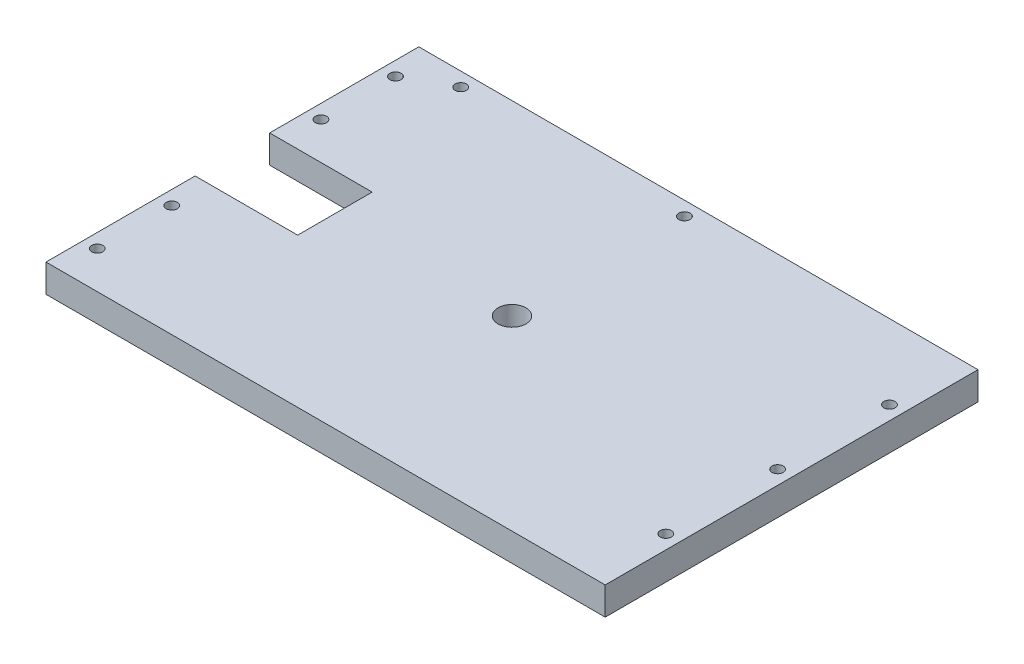
ISO-10303-21;
HEADER;
FILE_DESCRIPTION(('STEP AP214'),'2;1');
FILE_NAME('part.step','',(''),(''),'','','');
FILE_SCHEMA(('AUTOMOTIVE_DESIGN { 1 0 10303 214 1 1 1 1 }'));
ENDSEC;
DATA;
#1=APPLICATION_CONTEXT('core data for automotive mechanical design processes');
#2=APPLICATION_PROTOCOL_DEFINITION('international standard','automotive_design',2000,#1);
#3=PRODUCT_CONTEXT('',#1,'mechanical');
#4=PRODUCT('Part','Part','',(#3));
#5=PRODUCT_RELATED_PRODUCT_CATEGORY('part','',(#4));
#6=PRODUCT_DEFINITION_FORMATION('','',#4);
#7=PRODUCT_DEFINITION_CONTEXT('part definition',#1,'design');
#8=PRODUCT_DEFINITION('design','',#6,#7);
#9=PRODUCT_DEFINITION_SHAPE('','',#8);
#10=(LENGTH_UNIT() NAMED_UNIT(*) SI_UNIT(.MILLI.,.METRE.));
#11=(NAMED_UNIT(*) PLANE_ANGLE_UNIT() SI_UNIT($,.RADIAN.));
#12=(NAMED_UNIT(*) SI_UNIT($,.STERADIAN.) SOLID_ANGLE_UNIT());
#13=UNCERTAINTY_MEASURE_WITH_UNIT(LENGTH_MEASURE(1.E-05),#10,'distance_accuracy_value','');
#14=(GEOMETRIC_REPRESENTATION_CONTEXT(3) GLOBAL_UNCERTAINTY_ASSIGNED_CONTEXT((#13)) GLOBAL_UNIT_ASSIGNED_CONTEXT((#10,
#11,#12)) REPRESENTATION_CONTEXT('',''));
#15=CARTESIAN_POINT('',(0.,0.,0.));
#16=DIRECTION('',(0.,0.,1.));
#17=DIRECTION('',(1.,0.,0.));
#18=AXIS2_PLACEMENT_3D('',#15,#16,#17);
#19=CARTESIAN_POINT('',(0.,15.,0.));
#20=DIRECTION('',(0.,-1.,0.));
#21=DIRECTION('',(0.,0.,-1.));
#22=AXIS2_PLACEMENT_3D('',#19,#20,#21);
#23=PLANE('',#22);
#24=DIRECTION('',(0.,0.,1.));
#25=VECTOR('',#24,1.);
#26=CARTESIAN_POINT('',(-168.032786885246,15.,39.4262295081967));
#27=LINE('',#26,#25);
#28=CARTESIAN_POINT('',(-168.032786885246,15.,-40.5737704918033));
#29=VERTEX_POINT('',#28);
#30=CARTESIAN_POINT('',(-168.032786885246,15.,39.4262295081967));
#31=VERTEX_POINT('',#30);
#32=EDGE_CURVE('E145',#29,#31,#27,.T.);
#33=ORIENTED_EDGE('',*,*,#32,.T.);
#34=DIRECTION('',(1.,0.,0.));
#35=VECTOR('',#34,1.);
#36=CARTESIAN_POINT('',(-113.032786885246,15.,39.4262295081967));
#37=LINE('',#36,#35);
#38=CARTESIAN_POINT('',(-113.032786885246,15.,39.4262295081967));
#39=VERTEX_POINT('',#38);
#40=EDGE_CURVE('E93',#31,#39,#37,.T.);
#41=ORIENTED_EDGE('',*,*,#40,.T.);
#42=DIRECTION('',(0.,0.,1.));
#43=VECTOR('',#42,1.);
#44=CARTESIAN_POINT('',(-113.032786885246,15.,79.4262295081967));
#45=LINE('',#44,#43);
#46=CARTESIAN_POINT('',(-113.032786885246,15.,79.4262295081967));
#47=VERTEX_POINT('',#46);
#48=EDGE_CURVE('E160',#39,#47,#45,.T.);
#49=ORIENTED_EDGE('',*,*,#48,.T.);
#50=DIRECTION('',(-1.,0.,0.));
#51=VECTOR('',#50,1.);
#52=CARTESIAN_POINT('',(-168.032786885246,15.,79.4262295081967));
#53=LINE('',#52,#51);
#54=CARTESIAN_POINT('',(-168.032786885246,15.,79.4262295081967));
#55=VERTEX_POINT('',#54);
#56=EDGE_CURVE('E173',#47,#55,#53,.T.);
#57=ORIENTED_EDGE('',*,*,#56,.T.);
#58=DIRECTION('',(0.,0.,1.));
#59=VECTOR('',#58,1.);
#60=CARTESIAN_POINT('',(-168.032786885246,15.,159.426229508197));
#61=LINE('',#60,#59);
#62=CARTESIAN_POINT('',(-168.032786885246,15.,159.426229508197));
#63=VERTEX_POINT('',#62);
#64=EDGE_CURVE('E112',#55,#63,#61,.T.);
#65=ORIENTED_EDGE('',*,*,#64,.T.);
#66=DIRECTION('',(1.,0.,0.));
#67=VECTOR('',#66,1.);
#68=CARTESIAN_POINT('',(131.967213114754,15.,159.426229508197));
#69=LINE('',#68,#67);
#70=CARTESIAN_POINT('',(131.967213114754,15.,159.426229508197));
#71=VERTEX_POINT('',#70);
#72=EDGE_CURVE('E106',#63,#71,#69,.T.);
#73=ORIENTED_EDGE('',*,*,#72,.T.);
#74=DIRECTION('',(0.,0.,-1.));
#75=VECTOR('',#74,1.);
#76=CARTESIAN_POINT('',(131.967213114754,15.,-40.5737704918033));
#77=LINE('',#76,#75);
#78=CARTESIAN_POINT('',(131.967213114754,15.,-40.5737704918033));
#79=VERTEX_POINT('',#78);
#80=EDGE_CURVE('E110',#71,#79,#77,.T.);
#81=ORIENTED_EDGE('',*,*,#80,.T.);
#82=DIRECTION('',(-1.,0.,0.));
#83=VECTOR('',#82,1.);
#84=CARTESIAN_POINT('',(-168.032786885246,15.,-40.5737704918033));
#85=LINE('',#84,#83);
#86=EDGE_CURVE('E50',#79,#29,#85,.T.);
#87=ORIENTED_EDGE('',*,*,#86,.T.);
#88=EDGE_LOOP('',(#33,#41,#49,#57,#65,#73,#81,#87));
#89=FACE_BOUND('',#88,.T.);
#90=CARTESIAN_POINT('',(-18.032786885246,15.,59.4262295081967));
#91=DIRECTION('',(0.,1.,0.));
#92=DIRECTION('',(0.,0.,1.));
#93=AXIS2_PLACEMENT_3D('',#90,#91,#92);
#94=CIRCLE('',#93,7.5);
#95=CARTESIAN_POINT('',(-18.032786885246,15.,66.9262295081967));
#96=VERTEX_POINT('',#95);
#97=EDGE_CURVE('E134',#96,#96,#94,.T.);
#98=ORIENTED_EDGE('',*,*,#97,.F.);
#99=EDGE_LOOP('',(#98));
#100=FACE_BOUND('',#99,.T.);
#101=CARTESIAN_POINT('',(-160.532786885246,15.,-20.5737704918033));
#102=DIRECTION('',(0.,1.,0.));
#103=DIRECTION('',(0.,0.,1.));
#104=AXIS2_PLACEMENT_3D('',#101,#102,#103);
#105=CIRCLE('',#104,2.99999999999999);
#106=CARTESIAN_POINT('',(-160.532786885246,15.,-17.5737704918033));
#107=VERTEX_POINT('',#106);
#108=EDGE_CURVE('E182',#107,#107,#105,.T.);
#109=ORIENTED_EDGE('',*,*,#108,.F.);
#110=EDGE_LOOP('',(#109));
#111=FACE_BOUND('',#110,.T.);
#112=CARTESIAN_POINT('',(-160.532786885246,15.,19.4262295081967));
#113=DIRECTION('',(0.,1.,0.));
#114=DIRECTION('',(0.,0.,-1.));
#115=AXIS2_PLACEMENT_3D('',#112,#113,#114);
#116=CIRCLE('',#115,2.99999999999999);
#117=CARTESIAN_POINT('',(-160.532786885246,15.,16.4262295081967));
#118=VERTEX_POINT('',#117);
#119=EDGE_CURVE('E188',#118,#118,#116,.T.);
#120=ORIENTED_EDGE('',*,*,#119,.F.);
#121=EDGE_LOOP('',(#120));
#122=FACE_BOUND('',#121,.T.);
#123=CARTESIAN_POINT('',(-160.532786885246,15.,139.426229508197));
#124=DIRECTION('',(0.,1.,0.));
#125=DIRECTION('',(0.,0.,1.));
#126=AXIS2_PLACEMENT_3D('',#123,#124,#125);
#127=CIRCLE('',#126,2.99999999999999);
#128=CARTESIAN_POINT('',(-160.532786885246,15.,142.426229508197));
#129=VERTEX_POINT('',#128);
#130=EDGE_CURVE('E194',#129,#129,#127,.T.);
#131=ORIENTED_EDGE('',*,*,#130,.F.);
#132=EDGE_LOOP('',(#131));
#133=FACE_BOUND('',#132,.T.);
#134=CARTESIAN_POINT('',(-160.532786885246,15.,99.4262295081967));
#135=DIRECTION('',(0.,1.,0.));
#136=DIRECTION('',(0.,0.,-1.));
#137=AXIS2_PLACEMENT_3D('',#134,#135,#136);
#138=CIRCLE('',#137,2.99999999999999);
#139=CARTESIAN_POINT('',(-160.532786885246,15.,96.4262295081967));
#140=VERTEX_POINT('',#139);
#141=EDGE_CURVE('E200',#140,#140,#138,.T.);
#142=ORIENTED_EDGE('',*,*,#141,.F.);
#143=EDGE_LOOP('',(#142));
#144=FACE_BOUND('',#143,.T.);
#145=CARTESIAN_POINT('',(124.467213114754,15.,119.426229508197));
#146=DIRECTION('',(0.,1.,0.));
#147=DIRECTION('',(0.,0.,1.));
#148=AXIS2_PLACEMENT_3D('',#145,#146,#147);
#149=CIRCLE('',#148,3.00000000000001);
#150=CARTESIAN_POINT('',(124.467213114754,15.,122.426229508197));
#151=VERTEX_POINT('',#150);
#152=EDGE_CURVE('E206',#151,#151,#149,.T.);
#153=ORIENTED_EDGE('',*,*,#152,.F.);
#154=EDGE_LOOP('',(#153));
#155=FACE_BOUND('',#154,.T.);
#156=CARTESIAN_POINT('',(124.467213114754,15.,-0.573770491803266));
#157=DIRECTION('',(0.,1.,0.));
#158=DIRECTION('',(0.,0.,-1.));
#159=AXIS2_PLACEMENT_3D('',#156,#157,#158);
#160=CIRCLE('',#159,3.00000000000001);
#161=CARTESIAN_POINT('',(124.467213114754,15.,-3.57377049180327));
#162=VERTEX_POINT('',#161);
#163=EDGE_CURVE('E212',#162,#162,#160,.T.);
#164=ORIENTED_EDGE('',*,*,#163,.F.);
#165=EDGE_LOOP('',(#164));
#166=FACE_BOUND('',#165,.T.);
#167=CARTESIAN_POINT('',(124.467213114754,15.,59.4262295081967));
#168=DIRECTION('',(0.,1.,0.));
#169=DIRECTION('',(0.,0.,1.));
#170=AXIS2_PLACEMENT_3D('',#167,#168,#169);
#171=CIRCLE('',#170,2.99999999999999);
#172=CARTESIAN_POINT('',(124.467213114754,15.,62.4262295081967));
#173=VERTEX_POINT('',#172);
#174=EDGE_CURVE('E218',#173,#173,#171,.T.);
#175=ORIENTED_EDGE('',*,*,#174,.F.);
#176=EDGE_LOOP('',(#175));
#177=FACE_BOUND('',#176,.T.);
#178=CARTESIAN_POINT('',(-18.032786885246,15.,-33.0737704918033));
#179=DIRECTION('',(0.,1.,0.));
#180=DIRECTION('',(0.,0.,1.));
#181=AXIS2_PLACEMENT_3D('',#178,#179,#180);
#182=CIRCLE('',#181,3.);
#183=CARTESIAN_POINT('',(-18.032786885246,15.,-30.0737704918033));
#184=VERTEX_POINT('',#183);
#185=EDGE_CURVE('E224',#184,#184,#182,.T.);
#186=ORIENTED_EDGE('',*,*,#185,.F.);
#187=EDGE_LOOP('',(#186));
#188=FACE_BOUND('',#187,.T.);
#189=CARTESIAN_POINT('',(-138.032786885246,15.,-33.0737704918033));
#190=DIRECTION('',(0.,1.,0.));
#191=DIRECTION('',(0.,0.,1.));
#192=AXIS2_PLACEMENT_3D('',#189,#190,#191);
#193=CIRCLE('',#192,2.99999999999999);
#194=CARTESIAN_POINT('',(-138.032786885246,15.,-30.0737704918033));
#195=VERTEX_POINT('',#194);
#196=EDGE_CURVE('E230',#195,#195,#193,.T.);
#197=ORIENTED_EDGE('',*,*,#196,.F.);
#198=EDGE_LOOP('',(#197));
#199=FACE_BOUND('',#198,.T.);
#200=ADVANCED_FACE('F33',(#89,#100,#111,#122,#133,#144,#155,#166,#177,#188,#199),#23,.F.);
#201=CARTESIAN_POINT('',(0.,0.,0.));
#202=DIRECTION('',(0.,-1.,0.));
#203=DIRECTION('',(0.,0.,-1.));
#204=AXIS2_PLACEMENT_3D('',#201,#202,#203);
#205=PLANE('',#204);
#206=CARTESIAN_POINT('',(-18.032786885246,0.,-33.0737704918033));
#207=DIRECTION('',(0.,1.,0.));
#208=DIRECTION('',(0.,0.,1.));
#209=AXIS2_PLACEMENT_3D('',#206,#207,#208);
#210=CIRCLE('',#209,3.);
#211=CARTESIAN_POINT('',(-18.032786885246,0.,-30.0737704918033));
#212=VERTEX_POINT('',#211);
#213=EDGE_CURVE('E227',#212,#212,#210,.T.);
#214=ORIENTED_EDGE('',*,*,#213,.T.);
#215=EDGE_LOOP('',(#214));
#216=FACE_BOUND('',#215,.T.);
#217=CARTESIAN_POINT('',(124.467213114754,0.,-0.573770491803266));
#218=DIRECTION('',(0.,1.,0.));
#219=DIRECTION('',(0.,0.,-1.));
#220=AXIS2_PLACEMENT_3D('',#217,#218,#219);
#221=CIRCLE('',#220,3.00000000000001);
#222=CARTESIAN_POINT('',(124.467213114754,0.,-3.57377049180327));
#223=VERTEX_POINT('',#222);
#224=EDGE_CURVE('E215',#223,#223,#221,.T.);
#225=ORIENTED_EDGE('',*,*,#224,.T.);
#226=EDGE_LOOP('',(#225));
#227=FACE_BOUND('',#226,.T.);
#228=CARTESIAN_POINT('',(-160.532786885246,0.,99.4262295081967));
#229=DIRECTION('',(0.,1.,0.));
#230=DIRECTION('',(0.,0.,-1.));
#231=AXIS2_PLACEMENT_3D('',#228,#229,#230);
#232=CIRCLE('',#231,2.99999999999999);
#233=CARTESIAN_POINT('',(-160.532786885246,0.,96.4262295081967));
#234=VERTEX_POINT('',#233);
#235=EDGE_CURVE('E203',#234,#234,#232,.T.);
#236=ORIENTED_EDGE('',*,*,#235,.T.);
#237=EDGE_LOOP('',(#236));
#238=FACE_BOUND('',#237,.T.);
#239=CARTESIAN_POINT('',(-160.532786885246,0.,19.4262295081967));
#240=DIRECTION('',(0.,1.,0.));
#241=DIRECTION('',(0.,0.,-1.));
#242=AXIS2_PLACEMENT_3D('',#239,#240,#241);
#243=CIRCLE('',#242,2.99999999999999);
#244=CARTESIAN_POINT('',(-160.532786885246,0.,16.4262295081967));
#245=VERTEX_POINT('',#244);
#246=EDGE_CURVE('E191',#245,#245,#243,.T.);
#247=ORIENTED_EDGE('',*,*,#246,.T.);
#248=EDGE_LOOP('',(#247));
#249=FACE_BOUND('',#248,.T.);
#250=CARTESIAN_POINT('',(-18.032786885246,0.,59.4262295081967));
#251=DIRECTION('',(0.,1.,0.));
#252=DIRECTION('',(0.,0.,1.));
#253=AXIS2_PLACEMENT_3D('',#250,#251,#252);
#254=CIRCLE('',#253,7.5);
#255=CARTESIAN_POINT('',(-18.032786885246,0.,66.9262295081967));
#256=VERTEX_POINT('',#255);
#257=EDGE_CURVE('E179',#256,#256,#254,.T.);
#258=ORIENTED_EDGE('',*,*,#257,.T.);
#259=EDGE_LOOP('',(#258));
#260=FACE_BOUND('',#259,.T.);
#261=DIRECTION('',(0.,0.,1.));
#262=VECTOR('',#261,1.);
#263=CARTESIAN_POINT('',(-168.032786885246,0.,39.4262295081967));
#264=LINE('',#263,#262);
#265=CARTESIAN_POINT('',(-168.032786885246,0.,-40.5737704918033));
#266=VERTEX_POINT('',#265);
#267=CARTESIAN_POINT('',(-168.032786885246,0.,39.4262295081967));
#268=VERTEX_POINT('',#267);
#269=EDGE_CURVE('E130',#266,#268,#264,.T.);
#270=ORIENTED_EDGE('',*,*,#269,.F.);
#271=DIRECTION('',(-1.,0.,0.));
#272=VECTOR('',#271,1.);
#273=CARTESIAN_POINT('',(-168.032786885246,0.,-40.5737704918033));
#274=LINE('',#273,#272);
#275=CARTESIAN_POINT('',(131.967213114754,0.,-40.5737704918033));
#276=VERTEX_POINT('',#275);
#277=EDGE_CURVE('E85',#276,#266,#274,.T.);
#278=ORIENTED_EDGE('',*,*,#277,.F.);
#279=DIRECTION('',(0.,0.,-1.));
#280=VECTOR('',#279,1.);
#281=CARTESIAN_POINT('',(131.967213114754,0.,-40.5737704918033));
#282=LINE('',#281,#280);
#283=CARTESIAN_POINT('',(131.967213114754,0.,159.426229508197));
#284=VERTEX_POINT('',#283);
#285=EDGE_CURVE('E79',#284,#276,#282,.T.);
#286=ORIENTED_EDGE('',*,*,#285,.F.);
#287=DIRECTION('',(1.,0.,0.));
#288=VECTOR('',#287,1.);
#289=CARTESIAN_POINT('',(131.967213114754,0.,159.426229508197));
#290=LINE('',#289,#288);
#291=CARTESIAN_POINT('',(-168.032786885246,0.,159.426229508197));
#292=VERTEX_POINT('',#291);
#293=EDGE_CURVE('E120',#292,#284,#290,.T.);
#294=ORIENTED_EDGE('',*,*,#293,.F.);
#295=DIRECTION('',(0.,0.,1.));
#296=VECTOR('',#295,1.);
#297=CARTESIAN_POINT('',(-168.032786885246,0.,159.426229508197));
#298=LINE('',#297,#296);
#299=CARTESIAN_POINT('',(-168.032786885246,0.,79.4262295081967));
#300=VERTEX_POINT('',#299);
#301=EDGE_CURVE('E140',#300,#292,#298,.T.);
#302=ORIENTED_EDGE('',*,*,#301,.F.);
#303=DIRECTION('',(-1.,0.,0.));
#304=VECTOR('',#303,1.);
#305=CARTESIAN_POINT('',(-168.032786885246,0.,79.4262295081967));
#306=LINE('',#305,#304);
#307=CARTESIAN_POINT('',(-113.032786885246,0.,79.4262295081967));
#308=VERTEX_POINT('',#307);
#309=EDGE_CURVE('E138',#308,#300,#306,.T.);
#310=ORIENTED_EDGE('',*,*,#309,.F.);
#311=DIRECTION('',(0.,0.,1.));
#312=VECTOR('',#311,1.);
#313=CARTESIAN_POINT('',(-113.032786885246,0.,79.4262295081967));
#314=LINE('',#313,#312);
#315=CARTESIAN_POINT('',(-113.032786885246,0.,39.4262295081967));
#316=VERTEX_POINT('',#315);
#317=EDGE_CURVE('E136',#316,#308,#314,.T.);
#318=ORIENTED_EDGE('',*,*,#317,.F.);
#319=DIRECTION('',(1.,0.,0.));
#320=VECTOR('',#319,1.);
#321=CARTESIAN_POINT('',(-113.032786885246,0.,39.4262295081967));
#322=LINE('',#321,#320);
#323=EDGE_CURVE('E133',#268,#316,#322,.T.);
#324=ORIENTED_EDGE('',*,*,#323,.F.);
#325=EDGE_LOOP('',(#270,#278,#286,#294,#302,#310,#318,#324));
#326=FACE_BOUND('',#325,.T.);
#327=CARTESIAN_POINT('',(-160.532786885246,0.,-20.5737704918033));
#328=DIRECTION('',(0.,1.,0.));
#329=DIRECTION('',(0.,0.,1.));
#330=AXIS2_PLACEMENT_3D('',#327,#328,#329);
#331=CIRCLE('',#330,2.99999999999999);
#332=CARTESIAN_POINT('',(-160.532786885246,0.,-17.5737704918033));
#333=VERTEX_POINT('',#332);
#334=EDGE_CURVE('E185',#333,#333,#331,.T.);
#335=ORIENTED_EDGE('',*,*,#334,.T.);
#336=EDGE_LOOP('',(#335));
#337=FACE_BOUND('',#336,.T.);
#338=CARTESIAN_POINT('',(-160.532786885246,0.,139.426229508197));
#339=DIRECTION('',(0.,1.,0.));
#340=DIRECTION('',(0.,0.,1.));
#341=AXIS2_PLACEMENT_3D('',#338,#339,#340);
#342=CIRCLE('',#341,2.99999999999999);
#343=CARTESIAN_POINT('',(-160.532786885246,0.,142.426229508197));
#344=VERTEX_POINT('',#343);
#345=EDGE_CURVE('E197',#344,#344,#342,.T.);
#346=ORIENTED_EDGE('',*,*,#345,.T.);
#347=EDGE_LOOP('',(#346));
#348=FACE_BOUND('',#347,.T.);
#349=CARTESIAN_POINT('',(124.467213114754,0.,119.426229508197));
#350=DIRECTION('',(0.,1.,0.));
#351=DIRECTION('',(0.,0.,1.));
#352=AXIS2_PLACEMENT_3D('',#349,#350,#351);
#353=CIRCLE('',#352,3.00000000000001);
#354=CARTESIAN_POINT('',(124.467213114754,0.,122.426229508197));
#355=VERTEX_POINT('',#354);
#356=EDGE_CURVE('E209',#355,#355,#353,.T.);
#357=ORIENTED_EDGE('',*,*,#356,.T.);
#358=EDGE_LOOP('',(#357));
#359=FACE_BOUND('',#358,.T.);
#360=CARTESIAN_POINT('',(124.467213114754,0.,59.4262295081967));
#361=DIRECTION('',(0.,1.,0.));
#362=DIRECTION('',(0.,0.,1.));
#363=AXIS2_PLACEMENT_3D('',#360,#361,#362);
#364=CIRCLE('',#363,2.99999999999999);
#365=CARTESIAN_POINT('',(124.467213114754,0.,62.4262295081967));
#366=VERTEX_POINT('',#365);
#367=EDGE_CURVE('E221',#366,#366,#364,.T.);
#368=ORIENTED_EDGE('',*,*,#367,.T.);
#369=EDGE_LOOP('',(#368));
#370=FACE_BOUND('',#369,.T.);
#371=CARTESIAN_POINT('',(-138.032786885246,0.,-33.0737704918033));
#372=DIRECTION('',(0.,1.,0.));
#373=DIRECTION('',(0.,0.,1.));
#374=AXIS2_PLACEMENT_3D('',#371,#372,#373);
#375=CIRCLE('',#374,2.99999999999999);
#376=CARTESIAN_POINT('',(-138.032786885246,0.,-30.0737704918033));
#377=VERTEX_POINT('',#376);
#378=EDGE_CURVE('E233',#377,#377,#375,.T.);
#379=ORIENTED_EDGE('',*,*,#378,.T.);
#380=EDGE_LOOP('',(#379));
#381=FACE_BOUND('',#380,.T.);
#382=ADVANCED_FACE('F164',(#216,#227,#238,#249,#260,#326,#337,#348,#359,#370,#381),#205,.T.);
#383=CARTESIAN_POINT('',(-168.032786885246,15.,39.4262295081967));
#384=DIRECTION('',(1.,0.,0.));
#385=DIRECTION('',(0.,0.,-1.));
#386=AXIS2_PLACEMENT_3D('',#383,#384,#385);
#387=PLANE('',#386);
#388=ORIENTED_EDGE('',*,*,#269,.T.);
#389=DIRECTION('',(0.,-1.,0.));
#390=VECTOR('',#389,1.);
#391=CARTESIAN_POINT('',(-168.032786885246,15.,39.4262295081967));
#392=LINE('',#391,#390);
#393=EDGE_CURVE('E11',#31,#268,#392,.T.);
#394=ORIENTED_EDGE('',*,*,#393,.F.);
#395=ORIENTED_EDGE('',*,*,#32,.F.);
#396=DIRECTION('',(0.,-1.,0.));
#397=VECTOR('',#396,1.);
#398=CARTESIAN_POINT('',(-168.032786885246,15.,-40.5737704918033));
#399=LINE('',#398,#397);
#400=EDGE_CURVE('E126',#29,#266,#399,.T.);
#401=ORIENTED_EDGE('',*,*,#400,.T.);
#402=EDGE_LOOP('',(#388,#394,#395,#401));
#403=FACE_BOUND('',#402,.T.);
#404=ADVANCED_FACE('F35',(#403),#387,.F.);
#405=CARTESIAN_POINT('',(-113.032786885246,15.,39.4262295081967));
#406=DIRECTION('',(0.,0.,-1.));
#407=DIRECTION('',(-1.,0.,0.));
#408=AXIS2_PLACEMENT_3D('',#405,#406,#407);
#409=PLANE('',#408);
#410=ORIENTED_EDGE('',*,*,#323,.T.);
#411=DIRECTION('',(0.,-1.,0.));
#412=VECTOR('',#411,1.);
#413=CARTESIAN_POINT('',(-113.032786885246,15.,39.4262295081967));
#414=LINE('',#413,#412);
#415=EDGE_CURVE('E42',#39,#316,#414,.T.);
#416=ORIENTED_EDGE('',*,*,#415,.F.);
#417=ORIENTED_EDGE('',*,*,#40,.F.);
#418=ORIENTED_EDGE('',*,*,#393,.T.);
#419=EDGE_LOOP('',(#410,#416,#417,#418));
#420=FACE_BOUND('',#419,.T.);
#421=ADVANCED_FACE('F265',(#420),#409,.F.);
#422=CARTESIAN_POINT('',(-113.032786885246,15.,79.4262295081967));
#423=DIRECTION('',(1.,0.,0.));
#424=DIRECTION('',(0.,0.,-1.));
#425=AXIS2_PLACEMENT_3D('',#422,#423,#424);
#426=PLANE('',#425);
#427=ORIENTED_EDGE('',*,*,#317,.T.);
#428=DIRECTION('',(0.,-1.,0.));
#429=VECTOR('',#428,1.);
#430=CARTESIAN_POINT('',(-113.032786885246,15.,79.4262295081967));
#431=LINE('',#430,#429);
#432=EDGE_CURVE('E152',#47,#308,#431,.T.);
#433=ORIENTED_EDGE('',*,*,#432,.F.);
#434=ORIENTED_EDGE('',*,*,#48,.F.);
#435=ORIENTED_EDGE('',*,*,#415,.T.);
#436=EDGE_LOOP('',(#427,#433,#434,#435));
#437=FACE_BOUND('',#436,.T.);
#438=ADVANCED_FACE('F158',(#437),#426,.F.);
#439=CARTESIAN_POINT('',(-168.032786885246,15.,79.4262295081967));
#440=DIRECTION('',(0.,0.,1.));
#441=DIRECTION('',(1.,0.,0.));
#442=AXIS2_PLACEMENT_3D('',#439,#440,#441);
#443=PLANE('',#442);
#444=ORIENTED_EDGE('',*,*,#309,.T.);
#445=DIRECTION('',(0.,-1.,0.));
#446=VECTOR('',#445,1.);
#447=CARTESIAN_POINT('',(-168.032786885246,15.,79.4262295081967));
#448=LINE('',#447,#446);
#449=EDGE_CURVE('E149',#55,#300,#448,.T.);
#450=ORIENTED_EDGE('',*,*,#449,.F.);
#451=ORIENTED_EDGE('',*,*,#56,.F.);
#452=ORIENTED_EDGE('',*,*,#432,.T.);
#453=EDGE_LOOP('',(#444,#450,#451,#452));
#454=FACE_BOUND('',#453,.T.);
#455=ADVANCED_FACE('F169',(#454),#443,.F.);
#456=CARTESIAN_POINT('',(-168.032786885246,15.,159.426229508197));
#457=DIRECTION('',(1.,0.,0.));
#458=DIRECTION('',(0.,0.,-1.));
#459=AXIS2_PLACEMENT_3D('',#456,#457,#458);
#460=PLANE('',#459);
#461=ORIENTED_EDGE('',*,*,#301,.T.);
#462=DIRECTION('',(0.,-1.,0.));
#463=VECTOR('',#462,1.);
#464=CARTESIAN_POINT('',(-168.032786885246,15.,159.426229508197));
#465=LINE('',#464,#463);
#466=EDGE_CURVE('E121',#63,#292,#465,.T.);
#467=ORIENTED_EDGE('',*,*,#466,.F.);
#468=ORIENTED_EDGE('',*,*,#64,.F.);
#469=ORIENTED_EDGE('',*,*,#449,.T.);
#470=EDGE_LOOP('',(#461,#467,#468,#469));
#471=FACE_BOUND('',#470,.T.);
#472=ADVANCED_FACE('F172',(#471),#460,.F.);
#473=CARTESIAN_POINT('',(131.967213114754,15.,159.426229508197));
#474=DIRECTION('',(0.,0.,-1.));
#475=DIRECTION('',(-1.,0.,0.));
#476=AXIS2_PLACEMENT_3D('',#473,#474,#475);
#477=PLANE('',#476);
#478=ORIENTED_EDGE('',*,*,#293,.T.);
#479=DIRECTION('',(0.,-1.,0.));
#480=VECTOR('',#479,1.);
#481=CARTESIAN_POINT('',(131.967213114754,15.,159.426229508197));
#482=LINE('',#481,#480);
#483=EDGE_CURVE('E117',#71,#284,#482,.T.);
#484=ORIENTED_EDGE('',*,*,#483,.F.);
#485=ORIENTED_EDGE('',*,*,#72,.F.);
#486=ORIENTED_EDGE('',*,*,#466,.T.);
#487=EDGE_LOOP('',(#478,#484,#485,#486));
#488=FACE_BOUND('',#487,.T.);
#489=ADVANCED_FACE('F118',(#488),#477,.F.);
#490=CARTESIAN_POINT('',(131.967213114754,15.,-40.5737704918033));
#491=DIRECTION('',(-1.,0.,0.));
#492=DIRECTION('',(0.,0.,1.));
#493=AXIS2_PLACEMENT_3D('',#490,#491,#492);
#494=PLANE('',#493);
#495=ORIENTED_EDGE('',*,*,#285,.T.);
#496=DIRECTION('',(0.,-1.,0.));
#497=VECTOR('',#496,1.);
#498=CARTESIAN_POINT('',(131.967213114754,15.,-40.5737704918033));
#499=LINE('',#498,#497);
#500=EDGE_CURVE('E122',#79,#276,#499,.T.);
#501=ORIENTED_EDGE('',*,*,#500,.F.);
#502=ORIENTED_EDGE('',*,*,#80,.F.);
#503=ORIENTED_EDGE('',*,*,#483,.T.);
#504=EDGE_LOOP('',(#495,#501,#502,#503));
#505=FACE_BOUND('',#504,.T.);
#506=ADVANCED_FACE('F124',(#505),#494,.F.);
#507=CARTESIAN_POINT('',(-168.032786885246,15.,-40.5737704918033));
#508=DIRECTION('',(0.,0.,1.));
#509=DIRECTION('',(1.,0.,0.));
#510=AXIS2_PLACEMENT_3D('',#507,#508,#509);
#511=PLANE('',#510);
#512=ORIENTED_EDGE('',*,*,#277,.T.);
#513=ORIENTED_EDGE('',*,*,#400,.F.);
#514=ORIENTED_EDGE('',*,*,#86,.F.);
#515=ORIENTED_EDGE('',*,*,#500,.T.);
#516=EDGE_LOOP('',(#512,#513,#514,#515));
#517=FACE_BOUND('',#516,.T.);
#518=ADVANCED_FACE('F253',(#517),#511,.F.);
#519=CARTESIAN_POINT('',(-18.032786885246,15.,59.4262295081967));
#520=DIRECTION('',(0.,-1.,0.));
#521=DIRECTION('',(0.,0.,-1.));
#522=AXIS2_PLACEMENT_3D('',#519,#520,#521);
#523=CYLINDRICAL_SURFACE('',#522,7.5);
#524=ORIENTED_EDGE('',*,*,#97,.T.);
#525=EDGE_LOOP('',(#524));
#526=FACE_BOUND('',#525,.T.);
#527=ORIENTED_EDGE('',*,*,#257,.F.);
#528=EDGE_LOOP('',(#527));
#529=FACE_BOUND('',#528,.T.);
#530=ADVANCED_FACE('F250',(#526,#529),#523,.F.);
#531=CARTESIAN_POINT('',(-160.532786885246,15.,-20.5737704918033));
#532=DIRECTION('',(0.,-1.,0.));
#533=DIRECTION('',(0.,0.,-1.));
#534=AXIS2_PLACEMENT_3D('',#531,#532,#533);
#535=CYLINDRICAL_SURFACE('',#534,2.99999999999999);
#536=ORIENTED_EDGE('',*,*,#108,.T.);
#537=EDGE_LOOP('',(#536));
#538=FACE_BOUND('',#537,.T.);
#539=ORIENTED_EDGE('',*,*,#334,.F.);
#540=EDGE_LOOP('',(#539));
#541=FACE_BOUND('',#540,.T.);
#542=ADVANCED_FACE('F329',(#538,#541),#535,.F.);
#543=CARTESIAN_POINT('',(-160.532786885246,15.,19.4262295081967));
#544=DIRECTION('',(0.,-1.,0.));
#545=DIRECTION('',(0.,0.,-1.));
#546=AXIS2_PLACEMENT_3D('',#543,#544,#545);
#547=CYLINDRICAL_SURFACE('',#546,2.99999999999999);
#548=ORIENTED_EDGE('',*,*,#119,.T.);
#549=EDGE_LOOP('',(#548));
#550=FACE_BOUND('',#549,.T.);
#551=ORIENTED_EDGE('',*,*,#246,.F.);
#552=EDGE_LOOP('',(#551));
#553=FACE_BOUND('',#552,.T.);
#554=ADVANCED_FACE('F337',(#550,#553),#547,.F.);
#555=CARTESIAN_POINT('',(-160.532786885246,15.,139.426229508197));
#556=DIRECTION('',(0.,-1.,0.));
#557=DIRECTION('',(0.,0.,-1.));
#558=AXIS2_PLACEMENT_3D('',#555,#556,#557);
#559=CYLINDRICAL_SURFACE('',#558,2.99999999999999);
#560=ORIENTED_EDGE('',*,*,#130,.T.);
#561=EDGE_LOOP('',(#560));
#562=FACE_BOUND('',#561,.T.);
#563=ORIENTED_EDGE('',*,*,#345,.F.);
#564=EDGE_LOOP('',(#563));
#565=FACE_BOUND('',#564,.T.);
#566=ADVANCED_FACE('F345',(#562,#565),#559,.F.);
#567=CARTESIAN_POINT('',(-160.532786885246,15.,99.4262295081967));
#568=DIRECTION('',(0.,-1.,0.));
#569=DIRECTION('',(0.,0.,-1.));
#570=AXIS2_PLACEMENT_3D('',#567,#568,#569);
#571=CYLINDRICAL_SURFACE('',#570,2.99999999999999);
#572=ORIENTED_EDGE('',*,*,#141,.T.);
#573=EDGE_LOOP('',(#572));
#574=FACE_BOUND('',#573,.T.);
#575=ORIENTED_EDGE('',*,*,#235,.F.);
#576=EDGE_LOOP('',(#575));
#577=FACE_BOUND('',#576,.T.);
#578=ADVANCED_FACE('F354',(#574,#577),#571,.F.);
#579=CARTESIAN_POINT('',(124.467213114754,15.,119.426229508197));
#580=DIRECTION('',(0.,-1.,0.));
#581=DIRECTION('',(0.,0.,-1.));
#582=AXIS2_PLACEMENT_3D('',#579,#580,#581);
#583=CYLINDRICAL_SURFACE('',#582,3.00000000000001);
#584=ORIENTED_EDGE('',*,*,#152,.T.);
#585=EDGE_LOOP('',(#584));
#586=FACE_BOUND('',#585,.T.);
#587=ORIENTED_EDGE('',*,*,#356,.F.);
#588=EDGE_LOOP('',(#587));
#589=FACE_BOUND('',#588,.T.);
#590=ADVANCED_FACE('F363',(#586,#589),#583,.F.);
#591=CARTESIAN_POINT('',(124.467213114754,15.,-0.573770491803266));
#592=DIRECTION('',(0.,-1.,0.));
#593=DIRECTION('',(0.,0.,-1.));
#594=AXIS2_PLACEMENT_3D('',#591,#592,#593);
#595=CYLINDRICAL_SURFACE('',#594,3.00000000000001);
#596=ORIENTED_EDGE('',*,*,#163,.T.);
#597=EDGE_LOOP('',(#596));
#598=FACE_BOUND('',#597,.T.);
#599=ORIENTED_EDGE('',*,*,#224,.F.);
#600=EDGE_LOOP('',(#599));
#601=FACE_BOUND('',#600,.T.);
#602=ADVANCED_FACE('F372',(#598,#601),#595,.F.);
#603=CARTESIAN_POINT('',(124.467213114754,15.,59.4262295081967));
#604=DIRECTION('',(0.,-1.,0.));
#605=DIRECTION('',(0.,0.,-1.));
#606=AXIS2_PLACEMENT_3D('',#603,#604,#605);
#607=CYLINDRICAL_SURFACE('',#606,2.99999999999999);
#608=ORIENTED_EDGE('',*,*,#174,.T.);
#609=EDGE_LOOP('',(#608));
#610=FACE_BOUND('',#609,.T.);
#611=ORIENTED_EDGE('',*,*,#367,.F.);
#612=EDGE_LOOP('',(#611));
#613=FACE_BOUND('',#612,.T.);
#614=ADVANCED_FACE('F381',(#610,#613),#607,.F.);
#615=CARTESIAN_POINT('',(-18.032786885246,15.,-33.0737704918033));
#616=DIRECTION('',(0.,-1.,0.));
#617=DIRECTION('',(0.,0.,-1.));
#618=AXIS2_PLACEMENT_3D('',#615,#616,#617);
#619=CYLINDRICAL_SURFACE('',#618,3.);
#620=ORIENTED_EDGE('',*,*,#185,.T.);
#621=EDGE_LOOP('',(#620));
#622=FACE_BOUND('',#621,.T.);
#623=ORIENTED_EDGE('',*,*,#213,.F.);
#624=EDGE_LOOP('',(#623));
#625=FACE_BOUND('',#624,.T.);
#626=ADVANCED_FACE('F390',(#622,#625),#619,.F.);
#627=CARTESIAN_POINT('',(-138.032786885246,15.,-33.0737704918033));
#628=DIRECTION('',(0.,-1.,0.));
#629=DIRECTION('',(0.,0.,-1.));
#630=AXIS2_PLACEMENT_3D('',#627,#628,#629);
#631=CYLINDRICAL_SURFACE('',#630,2.99999999999999);
#632=ORIENTED_EDGE('',*,*,#196,.T.);
#633=EDGE_LOOP('',(#632));
#634=FACE_BOUND('',#633,.T.);
#635=ORIENTED_EDGE('',*,*,#378,.F.);
#636=EDGE_LOOP('',(#635));
#637=FACE_BOUND('',#636,.T.);
#638=ADVANCED_FACE('F239',(#634,#637),#631,.F.);
#639=CLOSED_SHELL('',(#200,#382,#404,#421,#438,#455,#472,#489,#506,#518,#530,#542,#554,#566,
#578,#590,#602,#614,#626,#638));
#640=MANIFOLD_SOLID_BREP('B2',#639);
#641=ADVANCED_BREP_SHAPE_REPRESENTATION('',(#18,#640),#14);
#642=SHAPE_DEFINITION_REPRESENTATION(#9,#641);
ENDSEC;
END-ISO-10303-21;
